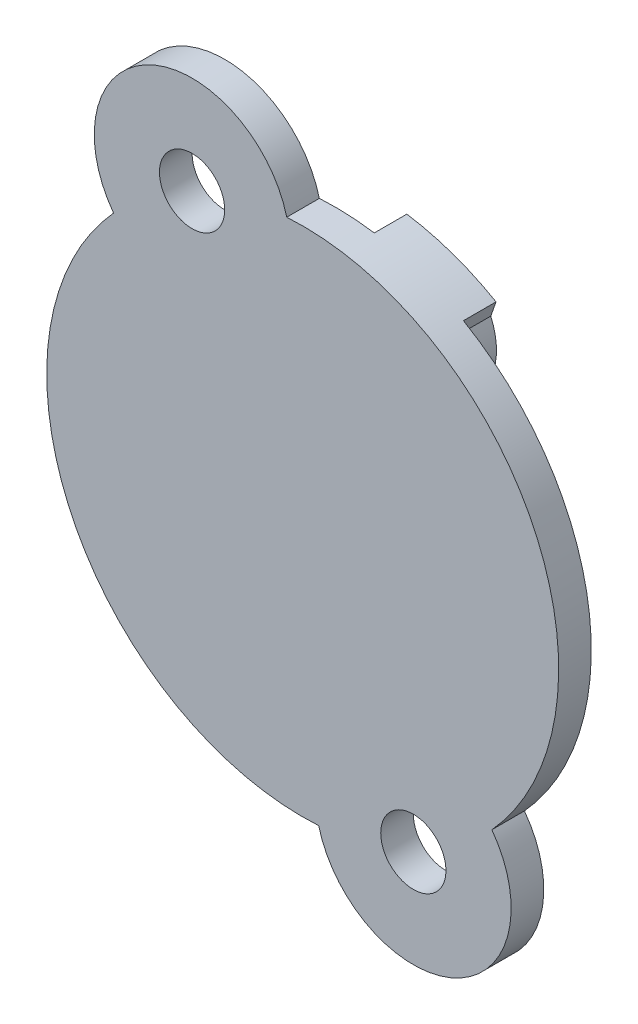
ISO-10303-21;
HEADER;
FILE_DESCRIPTION(('STEP AP214'),'2;1');
FILE_NAME('part.step','',(''),(''),'','','');
FILE_SCHEMA(('AUTOMOTIVE_DESIGN { 1 0 10303 214 1 1 1 1 }'));
ENDSEC;
DATA;
#1=APPLICATION_CONTEXT('core data for automotive mechanical design processes');
#2=APPLICATION_PROTOCOL_DEFINITION('international standard','automotive_design',2000,#1);
#3=PRODUCT_CONTEXT('',#1,'mechanical');
#4=PRODUCT('Part','Part','',(#3));
#5=PRODUCT_RELATED_PRODUCT_CATEGORY('part','',(#4));
#6=PRODUCT_DEFINITION_FORMATION('','',#4);
#7=PRODUCT_DEFINITION_CONTEXT('part definition',#1,'design');
#8=PRODUCT_DEFINITION('design','',#6,#7);
#9=PRODUCT_DEFINITION_SHAPE('','',#8);
#10=(LENGTH_UNIT() NAMED_UNIT(*) SI_UNIT(.MILLI.,.METRE.));
#11=(NAMED_UNIT(*) PLANE_ANGLE_UNIT() SI_UNIT($,.RADIAN.));
#12=(NAMED_UNIT(*) SI_UNIT($,.STERADIAN.) SOLID_ANGLE_UNIT());
#13=UNCERTAINTY_MEASURE_WITH_UNIT(LENGTH_MEASURE(1.E-05),#10,'distance_accuracy_value','');
#14=(GEOMETRIC_REPRESENTATION_CONTEXT(3) GLOBAL_UNCERTAINTY_ASSIGNED_CONTEXT((#13)) GLOBAL_UNIT_ASSIGNED_CONTEXT((#10,
#11,#12)) REPRESENTATION_CONTEXT('',''));
#15=CARTESIAN_POINT('',(0.,0.,0.));
#16=DIRECTION('',(0.,0.,1.));
#17=DIRECTION('',(1.,0.,0.));
#18=AXIS2_PLACEMENT_3D('',#15,#16,#17);
#19=CARTESIAN_POINT('',(0.,0.,1.));
#20=DIRECTION('',(0.,0.,-1.));
#21=DIRECTION('',(-1.,0.,0.));
#22=AXIS2_PLACEMENT_3D('',#19,#20,#21);
#23=CYLINDRICAL_SURFACE('',#22,7.85);
#24=CARTESIAN_POINT('',(0.,0.,0.));
#25=DIRECTION('',(0.,0.,1.));
#26=DIRECTION('',(1.,0.,0.));
#27=AXIS2_PLACEMENT_3D('',#24,#25,#26);
#28=CIRCLE('',#27,7.85);
#29=CARTESIAN_POINT('',(1.19385224811337,7.7586865389494,0.));
#30=VERTEX_POINT('',#29);
#31=CARTESIAN_POINT('',(-0.48961697061972,7.83471602689473,0.));
#32=VERTEX_POINT('',#31);
#33=EDGE_CURVE('E170',#30,#32,#28,.T.);
#34=ORIENTED_EDGE('',*,*,#33,.T.);
#35=DIRECTION('',(0.,0.,-1.));
#36=VECTOR('',#35,1.);
#37=CARTESIAN_POINT('',(-0.489616970619721,7.83471602689473,1.));
#38=LINE('',#37,#36);
#39=CARTESIAN_POINT('',(-0.48961697061972,7.83471602689473,1.));
#40=VERTEX_POINT('',#39);
#41=EDGE_CURVE('E71',#40,#32,#38,.T.);
#42=ORIENTED_EDGE('',*,*,#41,.F.);
#43=CARTESIAN_POINT('',(0.,0.,1.));
#44=DIRECTION('',(0.,0.,1.));
#45=DIRECTION('',(1.,0.,0.));
#46=AXIS2_PLACEMENT_3D('',#43,#44,#45);
#47=CIRCLE('',#46,7.85);
#48=CARTESIAN_POINT('',(5.80055716096692,-5.28923781109863,1.));
#49=VERTEX_POINT('',#48);
#50=EDGE_CURVE('E11',#49,#40,#47,.T.);
#51=ORIENTED_EDGE('',*,*,#50,.F.);
#52=DIRECTION('',(0.,0.,-1.));
#53=VECTOR('',#52,1.);
#54=CARTESIAN_POINT('',(5.80055716096691,-5.28923781109863,1.));
#55=LINE('',#54,#53);
#56=CARTESIAN_POINT('',(5.80055716096691,-5.28923781109863,0.));
#57=VERTEX_POINT('',#56);
#58=EDGE_CURVE('E196',#49,#57,#55,.T.);
#59=ORIENTED_EDGE('',*,*,#58,.T.);
#60=CARTESIAN_POINT('',(3.92933098166978,6.79579708617687,0.));
#61=VERTEX_POINT('',#60);
#62=EDGE_CURVE('E171',#57,#61,#28,.T.);
#63=ORIENTED_EDGE('',*,*,#62,.T.);
#64=DIRECTION('',(0.,0.,1.));
#65=VECTOR('',#64,1.);
#66=CARTESIAN_POINT('',(3.92933098166978,6.79579708617687,-1.));
#67=LINE('',#66,#65);
#68=CARTESIAN_POINT('',(3.92933098166978,6.79579708617687,-1.));
#69=VERTEX_POINT('',#68);
#70=EDGE_CURVE('E285',#69,#61,#67,.T.);
#71=ORIENTED_EDGE('',*,*,#70,.F.);
#72=CARTESIAN_POINT('',(0.,0.,-1.));
#73=DIRECTION('',(0.,0.,-1.));
#74=DIRECTION('',(-1.,0.,0.));
#75=AXIS2_PLACEMENT_3D('',#72,#73,#74);
#76=CIRCLE('',#75,7.85);
#77=CARTESIAN_POINT('',(1.19385224811337,7.7586865389494,-1.));
#78=VERTEX_POINT('',#77);
#79=EDGE_CURVE('E218',#78,#69,#76,.T.);
#80=ORIENTED_EDGE('',*,*,#79,.F.);
#81=DIRECTION('',(0.,0.,1.));
#82=VECTOR('',#81,1.);
#83=CARTESIAN_POINT('',(1.19385224811337,7.7586865389494,-1.));
#84=LINE('',#83,#82);
#85=EDGE_CURVE('E288',#78,#30,#84,.T.);
#86=ORIENTED_EDGE('',*,*,#85,.T.);
#87=EDGE_LOOP('',(#34,#42,#51,#59,#63,#71,#80,#86));
#88=FACE_BOUND('',#87,.T.);
#89=ADVANCED_FACE('F48',(#88),#23,.T.);
#90=CARTESIAN_POINT('',(0.,0.,0.));
#91=DIRECTION('',(0.,0.,1.));
#92=DIRECTION('',(1.,0.,0.));
#93=AXIS2_PLACEMENT_3D('',#90,#91,#92);
#94=PLANE('',#93);
#95=CARTESIAN_POINT('',(3.39285093810405,-7.07891676118645,0.));
#96=DIRECTION('',(0.,0.,-1.));
#97=DIRECTION('',(-1.,0.,0.));
#98=AXIS2_PLACEMENT_3D('',#95,#96,#97);
#99=CIRCLE('',#98,1.);
#100=CARTESIAN_POINT('',(2.39285093810405,-7.07891676118645,0.));
#101=VERTEX_POINT('',#100);
#102=EDGE_CURVE('E193',#101,#101,#99,.T.);
#103=ORIENTED_EDGE('',*,*,#102,.F.);
#104=EDGE_LOOP('',(#103));
#105=FACE_BOUND('',#104,.T.);
#106=CARTESIAN_POINT('',(-1.1938522481134,-7.7586865389494,0.));
#107=VERTEX_POINT('',#106);
#108=CARTESIAN_POINT('',(0.48961697061972,-7.83471602689473,0.));
#109=VERTEX_POINT('',#108);
#110=EDGE_CURVE('E52',#107,#109,#28,.T.);
#111=ORIENTED_EDGE('',*,*,#110,.F.);
#112=DIRECTION('',(0.332030845783635,0.943268528812556,0.));
#113=VECTOR('',#112,1.);
#114=CARTESIAN_POINT('',(1.3677393667782,-0.481444726386268,0.));
#115=LINE('',#114,#113);
#116=CARTESIAN_POINT('',(-1.03201281787639,-7.29891587847587,0.));
#117=VERTEX_POINT('',#116);
#118=EDGE_CURVE('E258',#107,#117,#115,.T.);
#119=ORIENTED_EDGE('',*,*,#118,.T.);
#120=CARTESIAN_POINT('',(-1.94238044783427,-5.51812089355345,0.));
#121=DIRECTION('',(0.,0.,-1.));
#122=DIRECTION('',(-1.,0.,0.));
#123=AXIS2_PLACEMENT_3D('',#120,#121,#122);
#124=CIRCLE('',#123,2.);
#125=CARTESIAN_POINT('',(-0.00130016548269144,-5.99999985913081,0.));
#126=VERTEX_POINT('',#125);
#127=EDGE_CURVE('E255',#126,#117,#124,.T.);
#128=ORIENTED_EDGE('',*,*,#127,.F.);
#129=CARTESIAN_POINT('',(0.,0.,0.));
#130=DIRECTION('',(0.,0.,-1.));
#131=DIRECTION('',(-1.,0.,0.));
#132=AXIS2_PLACEMENT_3D('',#129,#130,#131);
#133=CIRCLE('',#132,6.);
#134=CARTESIAN_POINT('',(3.75731738749284,4.6778805082691,0.));
#135=VERTEX_POINT('',#134);
#136=EDGE_CURVE('E243',#135,#126,#133,.T.);
#137=ORIENTED_EDGE('',*,*,#136,.F.);
#138=CARTESIAN_POINT('',(1.94238044783427,5.51812089355344,0.));
#139=DIRECTION('',(0.,0.,-1.));
#140=DIRECTION('',(-1.,0.,0.));
#141=AXIS2_PLACEMENT_3D('',#138,#139,#140);
#142=CIRCLE('',#141,2.);
#143=CARTESIAN_POINT('',(3.76749155143278,6.33602642570336,0.));
#144=VERTEX_POINT('',#143);
#145=EDGE_CURVE('E252',#144,#135,#142,.T.);
#146=ORIENTED_EDGE('',*,*,#145,.F.);
#147=DIRECTION('',(0.332030845783633,0.943268528812557,0.));
#148=VECTOR('',#147,1.);
#149=CARTESIAN_POINT('',(1.36773936677821,-0.481444726386269,0.));
#150=LINE('',#149,#148);
#151=EDGE_CURVE('E249',#144,#61,#150,.T.);
#152=ORIENTED_EDGE('',*,*,#151,.T.);
#153=ORIENTED_EDGE('',*,*,#62,.F.);
#154=CARTESIAN_POINT('',(3.39285093810405,-7.07891676118645,0.));
#155=DIRECTION('',(0.,0.,-1.));
#156=DIRECTION('',(-1.,0.,0.));
#157=AXIS2_PLACEMENT_3D('',#154,#155,#156);
#158=CIRCLE('',#157,3.);
#159=EDGE_CURVE('E187',#57,#109,#158,.T.);
#160=ORIENTED_EDGE('',*,*,#159,.T.);
#161=EDGE_LOOP('',(#111,#119,#128,#137,#146,#152,#153,#160));
#162=FACE_BOUND('',#161,.T.);
#163=ADVANCED_FACE('F309',(#105,#162),#94,.F.);
#164=CARTESIAN_POINT('',(-5.80055716096691,5.28923781109863,1.));
#165=VERTEX_POINT('',#164);
#166=CARTESIAN_POINT('',(0.48961697061972,-7.83471602689473,1.));
#167=VERTEX_POINT('',#166);
#168=EDGE_CURVE('E57',#165,#167,#47,.T.);
#169=ORIENTED_EDGE('',*,*,#168,.F.);
#170=DIRECTION('',(0.,0.,-1.));
#171=VECTOR('',#170,1.);
#172=CARTESIAN_POINT('',(-5.80055716096693,5.28923781109865,1.));
#173=LINE('',#172,#171);
#174=CARTESIAN_POINT('',(-5.80055716096693,5.28923781109865,0.));
#175=VERTEX_POINT('',#174);
#176=EDGE_CURVE('E172',#165,#175,#173,.T.);
#177=ORIENTED_EDGE('',*,*,#176,.T.);
#178=CARTESIAN_POINT('',(-3.92933098166981,-6.79579708617685,0.));
#179=VERTEX_POINT('',#178);
#180=EDGE_CURVE('E162',#175,#179,#28,.T.);
#181=ORIENTED_EDGE('',*,*,#180,.T.);
#182=DIRECTION('',(0.,0.,1.));
#183=VECTOR('',#182,1.);
#184=CARTESIAN_POINT('',(-3.92933098166981,-6.79579708617685,-1.));
#185=LINE('',#184,#183);
#186=CARTESIAN_POINT('',(-3.92933098166981,-6.79579708617685,-1.));
#187=VERTEX_POINT('',#186);
#188=EDGE_CURVE('E268',#187,#179,#185,.T.);
#189=ORIENTED_EDGE('',*,*,#188,.F.);
#190=CARTESIAN_POINT('',(0.,0.,-1.));
#191=DIRECTION('',(0.,0.,-1.));
#192=DIRECTION('',(-1.,0.,0.));
#193=AXIS2_PLACEMENT_3D('',#190,#191,#192);
#194=CIRCLE('',#193,7.85);
#195=CARTESIAN_POINT('',(-1.1938522481134,-7.7586865389494,-1.));
#196=VERTEX_POINT('',#195);
#197=EDGE_CURVE('E230',#196,#187,#194,.T.);
#198=ORIENTED_EDGE('',*,*,#197,.F.);
#199=DIRECTION('',(0.,0.,1.));
#200=VECTOR('',#199,1.);
#201=CARTESIAN_POINT('',(-1.1938522481134,-7.7586865389494,-1.));
#202=LINE('',#201,#200);
#203=EDGE_CURVE('E270',#196,#107,#202,.T.);
#204=ORIENTED_EDGE('',*,*,#203,.T.);
#205=ORIENTED_EDGE('',*,*,#110,.T.);
#206=DIRECTION('',(0.,0.,-1.));
#207=VECTOR('',#206,1.);
#208=CARTESIAN_POINT('',(0.48961697061972,-7.83471602689473,1.));
#209=LINE('',#208,#207);
#210=EDGE_CURVE('E201',#167,#109,#209,.T.);
#211=ORIENTED_EDGE('',*,*,#210,.F.);
#212=EDGE_LOOP('',(#169,#177,#181,#189,#198,#204,#205,#211));
#213=FACE_BOUND('',#212,.T.);
#214=ADVANCED_FACE('F50',(#213),#23,.T.);
#215=CARTESIAN_POINT('',(0.,0.,1.));
#216=DIRECTION('',(0.,0.,1.));
#217=DIRECTION('',(1.,0.,0.));
#218=AXIS2_PLACEMENT_3D('',#215,#216,#217);
#219=PLANE('',#218);
#220=CARTESIAN_POINT('',(3.39285093810405,-7.07891676118645,1.));
#221=DIRECTION('',(0.,0.,-1.));
#222=DIRECTION('',(-1.,0.,0.));
#223=AXIS2_PLACEMENT_3D('',#220,#221,#222);
#224=CIRCLE('',#223,1.);
#225=CARTESIAN_POINT('',(2.39285093810405,-7.07891676118645,1.));
#226=VERTEX_POINT('',#225);
#227=EDGE_CURVE('E192',#226,#226,#224,.T.);
#228=ORIENTED_EDGE('',*,*,#227,.T.);
#229=EDGE_LOOP('',(#228));
#230=FACE_BOUND('',#229,.T.);
#231=CARTESIAN_POINT('',(-3.39285093810405,7.07891676118645,1.));
#232=DIRECTION('',(0.,0.,-1.));
#233=DIRECTION('',(-1.,0.,0.));
#234=AXIS2_PLACEMENT_3D('',#231,#232,#233);
#235=CIRCLE('',#234,0.999999999999999);
#236=CARTESIAN_POINT('',(-4.39285093810405,7.07891676118645,1.));
#237=VERTEX_POINT('',#236);
#238=EDGE_CURVE('E176',#237,#237,#235,.T.);
#239=ORIENTED_EDGE('',*,*,#238,.T.);
#240=EDGE_LOOP('',(#239));
#241=FACE_BOUND('',#240,.T.);
#242=ORIENTED_EDGE('',*,*,#50,.T.);
#243=CARTESIAN_POINT('',(-3.39285093810405,7.07891676118645,1.));
#244=DIRECTION('',(0.,0.,-1.));
#245=DIRECTION('',(-1.,0.,0.));
#246=AXIS2_PLACEMENT_3D('',#243,#244,#245);
#247=CIRCLE('',#246,3.);
#248=EDGE_CURVE('E182',#165,#40,#247,.T.);
#249=ORIENTED_EDGE('',*,*,#248,.F.);
#250=ORIENTED_EDGE('',*,*,#168,.T.);
#251=CARTESIAN_POINT('',(3.39285093810405,-7.07891676118645,1.));
#252=DIRECTION('',(0.,0.,-1.));
#253=DIRECTION('',(-1.,0.,0.));
#254=AXIS2_PLACEMENT_3D('',#251,#252,#253);
#255=CIRCLE('',#254,3.);
#256=EDGE_CURVE('E189',#49,#167,#255,.T.);
#257=ORIENTED_EDGE('',*,*,#256,.F.);
#258=EDGE_LOOP('',(#242,#249,#250,#257));
#259=FACE_BOUND('',#258,.T.);
#260=ADVANCED_FACE('F302',(#230,#241,#259),#219,.T.);
#261=CARTESIAN_POINT('',(-3.39285093810405,7.07891676118645,0.));
#262=DIRECTION('',(0.,0.,-1.));
#263=DIRECTION('',(-1.,0.,0.));
#264=AXIS2_PLACEMENT_3D('',#261,#262,#263);
#265=CIRCLE('',#264,0.999999999999999);
#266=CARTESIAN_POINT('',(-4.39285093810405,7.07891676118645,0.));
#267=VERTEX_POINT('',#266);
#268=EDGE_CURVE('E179',#267,#267,#265,.T.);
#269=ORIENTED_EDGE('',*,*,#268,.F.);
#270=EDGE_LOOP('',(#269));
#271=FACE_BOUND('',#270,.T.);
#272=DIRECTION('',(0.332030845783634,0.943268528812557,0.));
#273=VECTOR('',#272,1.);
#274=CARTESIAN_POINT('',(-1.36773936677823,0.481444726386276,0.));
#275=LINE('',#274,#273);
#276=CARTESIAN_POINT('',(-3.7674915514328,-6.33602642570332,0.));
#277=VERTEX_POINT('',#276);
#278=EDGE_CURVE('E167',#179,#277,#275,.T.);
#279=ORIENTED_EDGE('',*,*,#278,.F.);
#280=ORIENTED_EDGE('',*,*,#180,.F.);
#281=CARTESIAN_POINT('',(-3.39285093810405,7.07891676118645,0.));
#282=DIRECTION('',(0.,0.,-1.));
#283=DIRECTION('',(-1.,0.,0.));
#284=AXIS2_PLACEMENT_3D('',#281,#282,#283);
#285=CIRCLE('',#284,3.);
#286=EDGE_CURVE('E165',#175,#32,#285,.T.);
#287=ORIENTED_EDGE('',*,*,#286,.T.);
#288=ORIENTED_EDGE('',*,*,#33,.F.);
#289=DIRECTION('',(0.332030845783635,0.943268528812556,0.));
#290=VECTOR('',#289,1.);
#291=CARTESIAN_POINT('',(-1.36773936677822,0.481444726386275,0.));
#292=LINE('',#291,#290);
#293=CARTESIAN_POINT('',(1.03201281787635,7.29891587847585,0.));
#294=VERTEX_POINT('',#293);
#295=EDGE_CURVE('E246',#294,#30,#292,.T.);
#296=ORIENTED_EDGE('',*,*,#295,.F.);
#297=CARTESIAN_POINT('',(1.94238044783427,5.51812089355344,0.));
#298=DIRECTION('',(0.,0.,-1.));
#299=DIRECTION('',(-1.,0.,0.));
#300=AXIS2_PLACEMENT_3D('',#297,#298,#299);
#301=CIRCLE('',#300,2.);
#302=CARTESIAN_POINT('',(0.00130016548269252,5.99999985913081,0.));
#303=VERTEX_POINT('',#302);
#304=EDGE_CURVE('E242',#303,#294,#301,.T.);
#305=ORIENTED_EDGE('',*,*,#304,.F.);
#306=CARTESIAN_POINT('',(-3.75731738749284,-4.6778805082691,0.));
#307=VERTEX_POINT('',#306);
#308=EDGE_CURVE('E239',#307,#303,#133,.T.);
#309=ORIENTED_EDGE('',*,*,#308,.F.);
#310=CARTESIAN_POINT('',(-1.94238044783427,-5.51812089355345,0.));
#311=DIRECTION('',(0.,0.,-1.));
#312=DIRECTION('',(-1.,0.,0.));
#313=AXIS2_PLACEMENT_3D('',#310,#311,#312);
#314=CIRCLE('',#313,2.);
#315=EDGE_CURVE('E210',#277,#307,#314,.T.);
#316=ORIENTED_EDGE('',*,*,#315,.F.);
#317=EDGE_LOOP('',(#279,#280,#287,#288,#296,#305,#309,#316));
#318=FACE_BOUND('',#317,.T.);
#319=ADVANCED_FACE('F163',(#271,#318),#94,.F.);
#320=CARTESIAN_POINT('',(0.,0.,-1.));
#321=DIRECTION('',(0.,0.,1.));
#322=DIRECTION('',(1.,0.,0.));
#323=AXIS2_PLACEMENT_3D('',#320,#321,#322);
#324=CYLINDRICAL_SURFACE('',#323,6.);
#325=ORIENTED_EDGE('',*,*,#308,.T.);
#326=DIRECTION('',(0.,0.,1.));
#327=VECTOR('',#326,1.);
#328=CARTESIAN_POINT('',(0.00130016548269252,5.99999985913081,-1.));
#329=LINE('',#328,#327);
#330=CARTESIAN_POINT('',(0.00130016548269252,5.99999985913081,-1.));
#331=VERTEX_POINT('',#330);
#332=EDGE_CURVE('E294',#331,#303,#329,.T.);
#333=ORIENTED_EDGE('',*,*,#332,.F.);
#334=CARTESIAN_POINT('',(0.,0.,-1.));
#335=DIRECTION('',(0.,0.,-1.));
#336=DIRECTION('',(-1.,0.,0.));
#337=AXIS2_PLACEMENT_3D('',#334,#335,#336);
#338=CIRCLE('',#337,6.);
#339=CARTESIAN_POINT('',(-3.75731738749284,-4.6778805082691,-1.));
#340=VERTEX_POINT('',#339);
#341=EDGE_CURVE('E209',#340,#331,#338,.T.);
#342=ORIENTED_EDGE('',*,*,#341,.F.);
#343=DIRECTION('',(0.,0.,1.));
#344=VECTOR('',#343,1.);
#345=CARTESIAN_POINT('',(-3.75731738749284,-4.6778805082691,-1.));
#346=LINE('',#345,#344);
#347=EDGE_CURVE('E236',#340,#307,#346,.T.);
#348=ORIENTED_EDGE('',*,*,#347,.T.);
#349=EDGE_LOOP('',(#325,#333,#342,#348));
#350=FACE_BOUND('',#349,.T.);
#351=ADVANCED_FACE('F342',(#350),#324,.T.);
#352=CARTESIAN_POINT('',(1.94238044783427,5.51812089355344,-1.));
#353=DIRECTION('',(0.,0.,1.));
#354=DIRECTION('',(1.,0.,0.));
#355=AXIS2_PLACEMENT_3D('',#352,#353,#354);
#356=CYLINDRICAL_SURFACE('',#355,2.);
#357=ORIENTED_EDGE('',*,*,#304,.T.);
#358=DIRECTION('',(0.,0.,1.));
#359=VECTOR('',#358,1.);
#360=CARTESIAN_POINT('',(1.03201281787635,7.29891587847585,-1.));
#361=LINE('',#360,#359);
#362=CARTESIAN_POINT('',(1.03201281787635,7.29891587847585,-1.));
#363=VERTEX_POINT('',#362);
#364=EDGE_CURVE('E291',#363,#294,#361,.T.);
#365=ORIENTED_EDGE('',*,*,#364,.F.);
#366=CARTESIAN_POINT('',(1.94238044783427,5.51812089355344,-1.));
#367=DIRECTION('',(0.,0.,-1.));
#368=DIRECTION('',(-1.,0.,0.));
#369=AXIS2_PLACEMENT_3D('',#366,#367,#368);
#370=CIRCLE('',#369,2.);
#371=EDGE_CURVE('E213',#331,#363,#370,.T.);
#372=ORIENTED_EDGE('',*,*,#371,.F.);
#373=ORIENTED_EDGE('',*,*,#332,.T.);
#374=EDGE_LOOP('',(#357,#365,#372,#373));
#375=FACE_BOUND('',#374,.T.);
#376=ADVANCED_FACE('F351',(#375),#356,.T.);
#377=CARTESIAN_POINT('',(-1.36773936677822,0.481444726386275,-1.));
#378=DIRECTION('',(0.943268528812556,-0.332030845783635,0.));
#379=DIRECTION('',(0.332030845783635,0.943268528812556,0.));
#380=AXIS2_PLACEMENT_3D('',#377,#378,#379);
#381=PLANE('',#380);
#382=ORIENTED_EDGE('',*,*,#295,.T.);
#383=ORIENTED_EDGE('',*,*,#85,.F.);
#384=DIRECTION('',(0.332030845783635,0.943268528812556,0.));
#385=VECTOR('',#384,1.);
#386=CARTESIAN_POINT('',(-1.36773936677822,0.481444726386275,-1.));
#387=LINE('',#386,#385);
#388=EDGE_CURVE('E216',#363,#78,#387,.T.);
#389=ORIENTED_EDGE('',*,*,#388,.F.);
#390=ORIENTED_EDGE('',*,*,#364,.T.);
#391=EDGE_LOOP('',(#382,#383,#389,#390));
#392=FACE_BOUND('',#391,.T.);
#393=ADVANCED_FACE('F354',(#392),#381,.F.);
#394=CARTESIAN_POINT('',(1.36773936677821,-0.481444726386269,-1.));
#395=DIRECTION('',(0.943268528812557,-0.332030845783633,0.));
#396=DIRECTION('',(0.332030845783633,0.943268528812557,0.));
#397=AXIS2_PLACEMENT_3D('',#394,#395,#396);
#398=PLANE('',#397);
#399=ORIENTED_EDGE('',*,*,#151,.F.);
#400=DIRECTION('',(0.,0.,1.));
#401=VECTOR('',#400,1.);
#402=CARTESIAN_POINT('',(3.76749155143278,6.33602642570336,-1.));
#403=LINE('',#402,#401);
#404=CARTESIAN_POINT('',(3.76749155143278,6.33602642570336,-1.));
#405=VERTEX_POINT('',#404);
#406=EDGE_CURVE('E282',#405,#144,#403,.T.);
#407=ORIENTED_EDGE('',*,*,#406,.F.);
#408=DIRECTION('',(0.332030845783633,0.943268528812557,0.));
#409=VECTOR('',#408,1.);
#410=CARTESIAN_POINT('',(1.36773936677821,-0.481444726386269,-1.));
#411=LINE('',#410,#409);
#412=EDGE_CURVE('E220',#405,#69,#411,.T.);
#413=ORIENTED_EDGE('',*,*,#412,.T.);
#414=ORIENTED_EDGE('',*,*,#70,.T.);
#415=EDGE_LOOP('',(#399,#407,#413,#414));
#416=FACE_BOUND('',#415,.T.);
#417=ADVANCED_FACE('F357',(#416),#398,.T.);
#418=CARTESIAN_POINT('',(1.94238044783427,5.51812089355344,-1.));
#419=DIRECTION('',(0.,0.,1.));
#420=DIRECTION('',(1.,0.,0.));
#421=AXIS2_PLACEMENT_3D('',#418,#419,#420);
#422=CYLINDRICAL_SURFACE('',#421,2.);
#423=ORIENTED_EDGE('',*,*,#145,.T.);
#424=DIRECTION('',(0.,0.,1.));
#425=VECTOR('',#424,1.);
#426=CARTESIAN_POINT('',(3.75731738749284,4.6778805082691,-1.));
#427=LINE('',#426,#425);
#428=CARTESIAN_POINT('',(3.75731738749284,4.6778805082691,-1.));
#429=VERTEX_POINT('',#428);
#430=EDGE_CURVE('E279',#429,#135,#427,.T.);
#431=ORIENTED_EDGE('',*,*,#430,.F.);
#432=CARTESIAN_POINT('',(1.94238044783427,5.51812089355344,-1.));
#433=DIRECTION('',(0.,0.,-1.));
#434=DIRECTION('',(-1.,0.,0.));
#435=AXIS2_PLACEMENT_3D('',#432,#433,#434);
#436=CIRCLE('',#435,2.);
#437=EDGE_CURVE('E223',#405,#429,#436,.T.);
#438=ORIENTED_EDGE('',*,*,#437,.F.);
#439=ORIENTED_EDGE('',*,*,#406,.T.);
#440=EDGE_LOOP('',(#423,#431,#438,#439));
#441=FACE_BOUND('',#440,.T.);
#442=ADVANCED_FACE('F361',(#441),#422,.T.);
#443=ORIENTED_EDGE('',*,*,#136,.T.);
#444=DIRECTION('',(0.,0.,1.));
#445=VECTOR('',#444,1.);
#446=CARTESIAN_POINT('',(-0.00130016548269144,-5.99999985913081,-1.));
#447=LINE('',#446,#445);
#448=CARTESIAN_POINT('',(-0.00130016548269144,-5.99999985913081,-1.));
#449=VERTEX_POINT('',#448);
#450=EDGE_CURVE('E276',#449,#126,#447,.T.);
#451=ORIENTED_EDGE('',*,*,#450,.F.);
#452=EDGE_CURVE('E214',#429,#449,#338,.T.);
#453=ORIENTED_EDGE('',*,*,#452,.F.);
#454=ORIENTED_EDGE('',*,*,#430,.T.);
#455=EDGE_LOOP('',(#443,#451,#453,#454));
#456=FACE_BOUND('',#455,.T.);
#457=ADVANCED_FACE('F365',(#456),#324,.T.);
#458=CARTESIAN_POINT('',(-1.94238044783427,-5.51812089355345,-1.));
#459=DIRECTION('',(0.,0.,1.));
#460=DIRECTION('',(1.,0.,0.));
#461=AXIS2_PLACEMENT_3D('',#458,#459,#460);
#462=CYLINDRICAL_SURFACE('',#461,2.);
#463=ORIENTED_EDGE('',*,*,#127,.T.);
#464=DIRECTION('',(0.,0.,1.));
#465=VECTOR('',#464,1.);
#466=CARTESIAN_POINT('',(-1.03201281787639,-7.29891587847587,-1.));
#467=LINE('',#466,#465);
#468=CARTESIAN_POINT('',(-1.03201281787639,-7.29891587847587,-1.));
#469=VERTEX_POINT('',#468);
#470=EDGE_CURVE('E273',#469,#117,#467,.T.);
#471=ORIENTED_EDGE('',*,*,#470,.F.);
#472=CARTESIAN_POINT('',(-1.94238044783427,-5.51812089355345,-1.));
#473=DIRECTION('',(0.,0.,-1.));
#474=DIRECTION('',(-1.,0.,0.));
#475=AXIS2_PLACEMENT_3D('',#472,#473,#474);
#476=CIRCLE('',#475,2.);
#477=EDGE_CURVE('E225',#449,#469,#476,.T.);
#478=ORIENTED_EDGE('',*,*,#477,.F.);
#479=ORIENTED_EDGE('',*,*,#450,.T.);
#480=EDGE_LOOP('',(#463,#471,#478,#479));
#481=FACE_BOUND('',#480,.T.);
#482=ADVANCED_FACE('F369',(#481),#462,.T.);
#483=CARTESIAN_POINT('',(1.3677393667782,-0.481444726386268,-1.));
#484=DIRECTION('',(0.943268528812556,-0.332030845783635,0.));
#485=DIRECTION('',(0.332030845783635,0.943268528812556,0.));
#486=AXIS2_PLACEMENT_3D('',#483,#484,#485);
#487=PLANE('',#486);
#488=ORIENTED_EDGE('',*,*,#118,.F.);
#489=ORIENTED_EDGE('',*,*,#203,.F.);
#490=DIRECTION('',(0.332030845783635,0.943268528812556,0.));
#491=VECTOR('',#490,1.);
#492=CARTESIAN_POINT('',(1.3677393667782,-0.481444726386268,-1.));
#493=LINE('',#492,#491);
#494=EDGE_CURVE('E227',#196,#469,#493,.T.);
#495=ORIENTED_EDGE('',*,*,#494,.T.);
#496=ORIENTED_EDGE('',*,*,#470,.T.);
#497=EDGE_LOOP('',(#488,#489,#495,#496));
#498=FACE_BOUND('',#497,.T.);
#499=ADVANCED_FACE('F373',(#498),#487,.T.);
#500=CARTESIAN_POINT('',(-1.36773936677823,0.481444726386276,-1.));
#501=DIRECTION('',(0.943268528812557,-0.332030845783634,0.));
#502=DIRECTION('',(0.332030845783634,0.943268528812557,0.));
#503=AXIS2_PLACEMENT_3D('',#500,#501,#502);
#504=PLANE('',#503);
#505=ORIENTED_EDGE('',*,*,#278,.T.);
#506=DIRECTION('',(0.,0.,1.));
#507=VECTOR('',#506,1.);
#508=CARTESIAN_POINT('',(-3.7674915514328,-6.33602642570332,-1.));
#509=LINE('',#508,#507);
#510=CARTESIAN_POINT('',(-3.7674915514328,-6.33602642570332,-1.));
#511=VERTEX_POINT('',#510);
#512=EDGE_CURVE('E265',#511,#277,#509,.T.);
#513=ORIENTED_EDGE('',*,*,#512,.F.);
#514=DIRECTION('',(0.332030845783634,0.943268528812557,0.));
#515=VECTOR('',#514,1.);
#516=CARTESIAN_POINT('',(-1.36773936677823,0.481444726386276,-1.));
#517=LINE('',#516,#515);
#518=EDGE_CURVE('E232',#187,#511,#517,.T.);
#519=ORIENTED_EDGE('',*,*,#518,.F.);
#520=ORIENTED_EDGE('',*,*,#188,.T.);
#521=EDGE_LOOP('',(#505,#513,#519,#520));
#522=FACE_BOUND('',#521,.T.);
#523=ADVANCED_FACE('F349',(#522),#504,.F.);
#524=CARTESIAN_POINT('',(0.,0.,-1.));
#525=DIRECTION('',(0.,0.,1.));
#526=DIRECTION('',(1.,0.,0.));
#527=AXIS2_PLACEMENT_3D('',#524,#525,#526);
#528=CYLINDRICAL_SURFACE('',#527,4.5);
#529=CARTESIAN_POINT('',(0.,0.,-1.));
#530=DIRECTION('',(0.,0.,-1.));
#531=DIRECTION('',(-1.,0.,0.));
#532=AXIS2_PLACEMENT_3D('',#529,#530,#531);
#533=CIRCLE('',#532,4.5);
#534=CARTESIAN_POINT('',(-4.5,0.,-1.));
#535=VERTEX_POINT('',#534);
#536=EDGE_CURVE('E206',#535,#535,#533,.T.);
#537=ORIENTED_EDGE('',*,*,#536,.T.);
#538=EDGE_LOOP('',(#537));
#539=FACE_BOUND('',#538,.T.);
#540=CARTESIAN_POINT('',(0.,0.,0.));
#541=DIRECTION('',(0.,0.,-1.));
#542=DIRECTION('',(-1.,0.,0.));
#543=AXIS2_PLACEMENT_3D('',#540,#541,#542);
#544=CIRCLE('',#543,4.5);
#545=CARTESIAN_POINT('',(-4.5,0.,0.));
#546=VERTEX_POINT('',#545);
#547=EDGE_CURVE('E203',#546,#546,#544,.T.);
#548=ORIENTED_EDGE('',*,*,#547,.F.);
#549=EDGE_LOOP('',(#548));
#550=FACE_BOUND('',#549,.T.);
#551=ADVANCED_FACE('F345',(#539,#550),#528,.F.);
#552=CARTESIAN_POINT('',(-1.94238044783427,-5.51812089355345,-1.));
#553=DIRECTION('',(0.,0.,1.));
#554=DIRECTION('',(1.,0.,0.));
#555=AXIS2_PLACEMENT_3D('',#552,#553,#554);
#556=CYLINDRICAL_SURFACE('',#555,2.);
#557=ORIENTED_EDGE('',*,*,#315,.T.);
#558=ORIENTED_EDGE('',*,*,#347,.F.);
#559=CARTESIAN_POINT('',(-1.94238044783427,-5.51812089355345,-1.));
#560=DIRECTION('',(0.,0.,-1.));
#561=DIRECTION('',(-1.,0.,0.));
#562=AXIS2_PLACEMENT_3D('',#559,#560,#561);
#563=CIRCLE('',#562,2.);
#564=EDGE_CURVE('E234',#511,#340,#563,.T.);
#565=ORIENTED_EDGE('',*,*,#564,.F.);
#566=ORIENTED_EDGE('',*,*,#512,.T.);
#567=EDGE_LOOP('',(#557,#558,#565,#566));
#568=FACE_BOUND('',#567,.T.);
#569=ADVANCED_FACE('F348',(#568),#556,.T.);
#570=CARTESIAN_POINT('',(0.,0.,-1.));
#571=DIRECTION('',(0.,0.,-1.));
#572=DIRECTION('',(-1.,0.,0.));
#573=AXIS2_PLACEMENT_3D('',#570,#571,#572);
#574=PLANE('',#573);
#575=ORIENTED_EDGE('',*,*,#536,.F.);
#576=EDGE_LOOP('',(#575));
#577=FACE_BOUND('',#576,.T.);
#578=ORIENTED_EDGE('',*,*,#341,.T.);
#579=ORIENTED_EDGE('',*,*,#371,.T.);
#580=ORIENTED_EDGE('',*,*,#388,.T.);
#581=ORIENTED_EDGE('',*,*,#79,.T.);
#582=ORIENTED_EDGE('',*,*,#412,.F.);
#583=ORIENTED_EDGE('',*,*,#437,.T.);
#584=ORIENTED_EDGE('',*,*,#452,.T.);
#585=ORIENTED_EDGE('',*,*,#477,.T.);
#586=ORIENTED_EDGE('',*,*,#494,.F.);
#587=ORIENTED_EDGE('',*,*,#197,.T.);
#588=ORIENTED_EDGE('',*,*,#518,.T.);
#589=ORIENTED_EDGE('',*,*,#564,.T.);
#590=EDGE_LOOP('',(#578,#579,#580,#581,#582,#583,#584,#585,#586,#587,#588,#589));
#591=FACE_BOUND('',#590,.T.);
#592=ADVANCED_FACE('F383',(#577,#591),#574,.T.);
#593=ORIENTED_EDGE('',*,*,#547,.T.);
#594=EDGE_LOOP('',(#593));
#595=FACE_BOUND('',#594,.T.);
#596=ADVANCED_FACE('F333',(#595),#94,.F.);
#597=CARTESIAN_POINT('',(3.39285093810405,-7.07891676118645,1.));
#598=DIRECTION('',(0.,0.,-1.));
#599=DIRECTION('',(-1.,0.,0.));
#600=AXIS2_PLACEMENT_3D('',#597,#598,#599);
#601=CYLINDRICAL_SURFACE('',#600,1.);
#602=ORIENTED_EDGE('',*,*,#102,.T.);
#603=EDGE_LOOP('',(#602));
#604=FACE_BOUND('',#603,.T.);
#605=ORIENTED_EDGE('',*,*,#227,.F.);
#606=EDGE_LOOP('',(#605));
#607=FACE_BOUND('',#606,.T.);
#608=ADVANCED_FACE('F325',(#604,#607),#601,.F.);
#609=CARTESIAN_POINT('',(3.39285093810405,-7.07891676118645,1.));
#610=DIRECTION('',(0.,0.,-1.));
#611=DIRECTION('',(-1.,0.,0.));
#612=AXIS2_PLACEMENT_3D('',#609,#610,#611);
#613=CYLINDRICAL_SURFACE('',#612,3.);
#614=ORIENTED_EDGE('',*,*,#159,.F.);
#615=ORIENTED_EDGE('',*,*,#58,.F.);
#616=ORIENTED_EDGE('',*,*,#256,.T.);
#617=ORIENTED_EDGE('',*,*,#210,.T.);
#618=EDGE_LOOP('',(#614,#615,#616,#617));
#619=FACE_BOUND('',#618,.T.);
#620=ADVANCED_FACE('F305',(#619),#613,.T.);
#621=CARTESIAN_POINT('',(-3.39285093810405,7.07891676118645,1.));
#622=DIRECTION('',(0.,0.,-1.));
#623=DIRECTION('',(-1.,0.,0.));
#624=AXIS2_PLACEMENT_3D('',#621,#622,#623);
#625=CYLINDRICAL_SURFACE('',#624,0.999999999999999);
#626=ORIENTED_EDGE('',*,*,#268,.T.);
#627=EDGE_LOOP('',(#626));
#628=FACE_BOUND('',#627,.T.);
#629=ORIENTED_EDGE('',*,*,#238,.F.);
#630=EDGE_LOOP('',(#629));
#631=FACE_BOUND('',#630,.T.);
#632=ADVANCED_FACE('F314',(#628,#631),#625,.F.);
#633=CARTESIAN_POINT('',(-3.39285093810405,7.07891676118645,1.));
#634=DIRECTION('',(0.,0.,-1.));
#635=DIRECTION('',(-1.,0.,0.));
#636=AXIS2_PLACEMENT_3D('',#633,#634,#635);
#637=CYLINDRICAL_SURFACE('',#636,3.);
#638=ORIENTED_EDGE('',*,*,#286,.F.);
#639=ORIENTED_EDGE('',*,*,#176,.F.);
#640=ORIENTED_EDGE('',*,*,#248,.T.);
#641=ORIENTED_EDGE('',*,*,#41,.T.);
#642=EDGE_LOOP('',(#638,#639,#640,#641));
#643=FACE_BOUND('',#642,.T.);
#644=ADVANCED_FACE('F178',(#643),#637,.T.);
#645=CLOSED_SHELL('',(#89,#163,#214,#260,#319,#351,#376,#393,#417,#442,#457,#482,#499,#523,#551,
#569,#592,#596,#608,#620,#632,#644));
#646=MANIFOLD_SOLID_BREP('B2',#645);
#647=ADVANCED_BREP_SHAPE_REPRESENTATION('',(#18,#646),#14);
#648=SHAPE_DEFINITION_REPRESENTATION(#9,#647);
ENDSEC;
END-ISO-10303-21;
